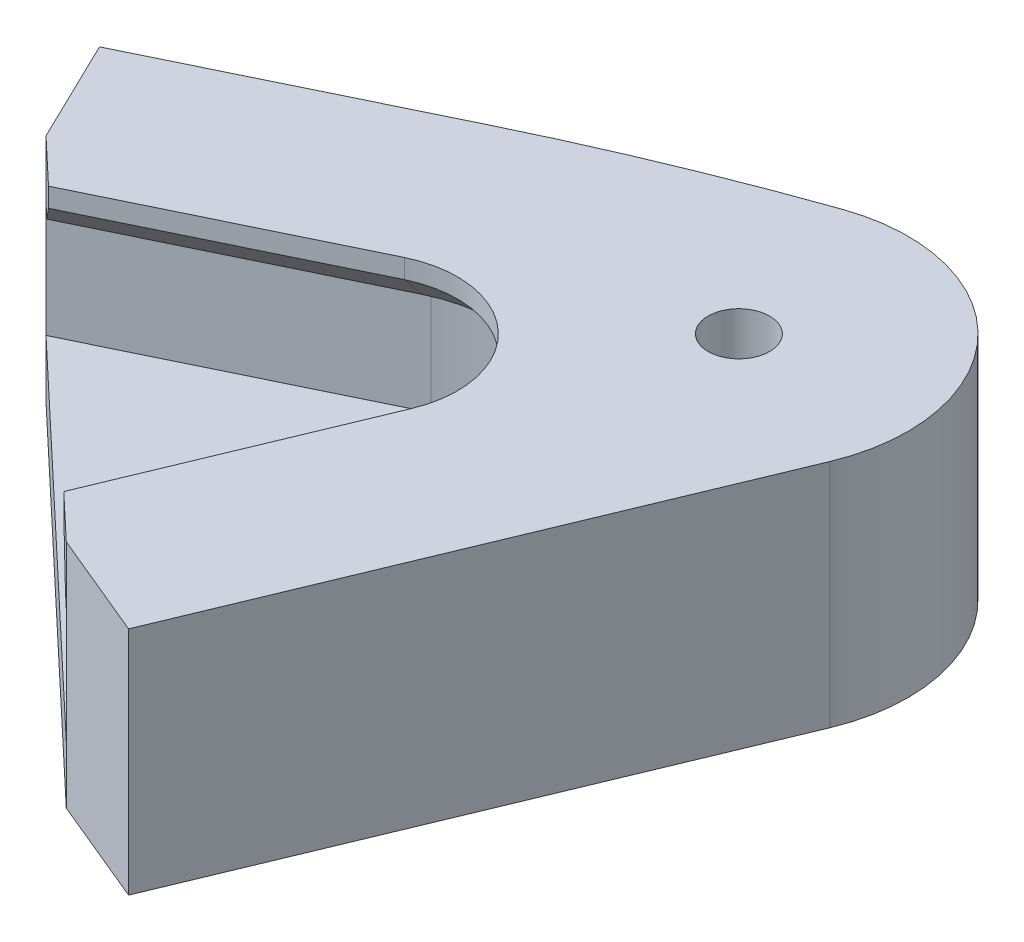
ISO-10303-21;
HEADER;
FILE_DESCRIPTION(('STEP AP214'),'2;1');
FILE_NAME('part.step','',(''),(''),'','','');
FILE_SCHEMA(('AUTOMOTIVE_DESIGN { 1 0 10303 214 1 1 1 1 }'));
ENDSEC;
DATA;
#1=APPLICATION_CONTEXT('core data for automotive mechanical design processes');
#2=APPLICATION_PROTOCOL_DEFINITION('international standard','automotive_design',2000,#1);
#3=PRODUCT_CONTEXT('',#1,'mechanical');
#4=PRODUCT('Part','Part','',(#3));
#5=PRODUCT_RELATED_PRODUCT_CATEGORY('part','',(#4));
#6=PRODUCT_DEFINITION_FORMATION('','',#4);
#7=PRODUCT_DEFINITION_CONTEXT('part definition',#1,'design');
#8=PRODUCT_DEFINITION('design','',#6,#7);
#9=PRODUCT_DEFINITION_SHAPE('','',#8);
#10=(LENGTH_UNIT() NAMED_UNIT(*) SI_UNIT(.MILLI.,.METRE.));
#11=(NAMED_UNIT(*) PLANE_ANGLE_UNIT() SI_UNIT($,.RADIAN.));
#12=(NAMED_UNIT(*) SI_UNIT($,.STERADIAN.) SOLID_ANGLE_UNIT());
#13=UNCERTAINTY_MEASURE_WITH_UNIT(LENGTH_MEASURE(1.E-05),#10,'distance_accuracy_value','');
#14=(GEOMETRIC_REPRESENTATION_CONTEXT(3) GLOBAL_UNCERTAINTY_ASSIGNED_CONTEXT((#13)) GLOBAL_UNIT_ASSIGNED_CONTEXT((#10,
#11,#12)) REPRESENTATION_CONTEXT('',''));
#15=CARTESIAN_POINT('',(0.,0.,0.));
#16=DIRECTION('',(0.,0.,1.));
#17=DIRECTION('',(1.,0.,0.));
#18=AXIS2_PLACEMENT_3D('',#15,#16,#17);
#19=CARTESIAN_POINT('',(40.9302236157556,6.,-79.9919728911341));
#20=DIRECTION('',(0.899983686293208,0.,-0.435923576336597));
#21=DIRECTION('',(-0.435923576336597,0.,-0.899983686293208));
#22=AXIS2_PLACEMENT_3D('',#19,#20,#21);
#23=PLANE('',#22);
#24=DIRECTION('',(0.,-1.,0.));
#25=VECTOR('',#24,1.);
#26=CARTESIAN_POINT('',(38.314682157736,6.,-85.3918750088934));
#27=LINE('',#26,#25);
#28=CARTESIAN_POINT('',(38.314682157736,9.,-85.3918750088934));
#29=VERTEX_POINT('',#28);
#30=CARTESIAN_POINT('',(38.314682157736,-3.,-85.3918750088934));
#31=VERTEX_POINT('',#30);
#32=EDGE_CURVE('E156',#29,#31,#27,.T.);
#33=ORIENTED_EDGE('',*,*,#32,.T.);
#34=DIRECTION('',(-0.435923576336597,0.,-0.899983686293208));
#35=VECTOR('',#34,1.);
#36=CARTESIAN_POINT('',(40.9302236157556,-3.,-79.9919728911341));
#37=LINE('',#36,#35);
#38=CARTESIAN_POINT('',(40.9302236157556,-3.,-79.9919728911341));
#39=VERTEX_POINT('',#38);
#40=EDGE_CURVE('E244',#39,#31,#37,.T.);
#41=ORIENTED_EDGE('',*,*,#40,.F.);
#42=DIRECTION('',(0.,1.,0.));
#43=VECTOR('',#42,1.);
#44=CARTESIAN_POINT('',(40.9302236157556,-3.,-79.9919728911341));
#45=LINE('',#44,#43);
#46=CARTESIAN_POINT('',(40.9302236157556,0.,-79.9919728911341));
#47=VERTEX_POINT('',#46);
#48=EDGE_CURVE('E250',#39,#47,#45,.T.);
#49=ORIENTED_EDGE('',*,*,#48,.T.);
#50=DIRECTION('',(0.,-1.,0.));
#51=VECTOR('',#50,1.);
#52=CARTESIAN_POINT('',(40.9302236157556,6.,-79.9919728911341));
#53=LINE('',#52,#51);
#54=CARTESIAN_POINT('',(40.9302236157556,6.,-79.9919728911341));
#55=VERTEX_POINT('',#54);
#56=EDGE_CURVE('E290',#55,#47,#53,.T.);
#57=ORIENTED_EDGE('',*,*,#56,.F.);
#58=DIRECTION('',(0.,-1.,0.));
#59=VECTOR('',#58,1.);
#60=CARTESIAN_POINT('',(40.9302236157556,9.,-79.9919728911341));
#61=LINE('',#60,#59);
#62=CARTESIAN_POINT('',(40.9302236157556,9.,-79.9919728911341));
#63=VERTEX_POINT('',#62);
#64=EDGE_CURVE('E173',#63,#55,#61,.T.);
#65=ORIENTED_EDGE('',*,*,#64,.F.);
#66=DIRECTION('',(0.435923576336597,0.,0.899983686293208));
#67=VECTOR('',#66,1.);
#68=CARTESIAN_POINT('',(38.314682157736,9.,-85.3918750088934));
#69=LINE('',#68,#67);
#70=EDGE_CURVE('E170',#29,#63,#69,.T.);
#71=ORIENTED_EDGE('',*,*,#70,.F.);
#72=EDGE_LOOP('',(#33,#41,#49,#57,#65,#71));
#73=FACE_BOUND('',#72,.T.);
#74=ADVANCED_FACE('F35',(#73),#23,.F.);
#75=CARTESIAN_POINT('',(40.9302236157556,6.,-79.9919728911341));
#76=DIRECTION('',(-0.435923576336596,0.,-0.899983686293208));
#77=DIRECTION('',(-0.899983686293208,0.,0.435923576336596));
#78=AXIS2_PLACEMENT_3D('',#75,#76,#77);
#79=PLANE('',#78);
#80=DIRECTION('',(0.899983686293208,0.,-0.435923576336596));
#81=VECTOR('',#80,1.);
#82=CARTESIAN_POINT('',(40.9302236157556,0.,-79.9919728911341));
#83=LINE('',#82,#81);
#84=CARTESIAN_POINT('',(54.4299789101537,0.,-86.530826536183));
#85=VERTEX_POINT('',#84);
#86=EDGE_CURVE('E257',#47,#85,#83,.T.);
#87=ORIENTED_EDGE('',*,*,#86,.T.);
#88=DIRECTION('',(0.,-1.,0.));
#89=VECTOR('',#88,1.);
#90=CARTESIAN_POINT('',(54.4299789101537,6.,-86.530826536183));
#91=LINE('',#90,#89);
#92=CARTESIAN_POINT('',(54.4299789101537,6.,-86.530826536183));
#93=VERTEX_POINT('',#92);
#94=EDGE_CURVE('E287',#93,#85,#91,.T.);
#95=ORIENTED_EDGE('',*,*,#94,.F.);
#96=DIRECTION('',(0.899983686293208,0.,-0.435923576336596));
#97=VECTOR('',#96,1.);
#98=CARTESIAN_POINT('',(40.9302236157556,6.,-79.9919728911341));
#99=LINE('',#98,#97);
#100=EDGE_CURVE('E258',#55,#93,#99,.T.);
#101=ORIENTED_EDGE('',*,*,#100,.F.);
#102=ORIENTED_EDGE('',*,*,#56,.T.);
#103=EDGE_LOOP('',(#87,#95,#101,#102));
#104=FACE_BOUND('',#103,.T.);
#105=ADVANCED_FACE('F336',(#104),#79,.F.);
#106=CARTESIAN_POINT('',(57.9827560572969,6.,-79.1959594928934));
#107=DIRECTION('',(0.,-1.,0.));
#108=DIRECTION('',(0.,0.,-1.));
#109=AXIS2_PLACEMENT_3D('',#106,#107,#108);
#110=CYLINDRICAL_SURFACE('',#109,8.14999999999999);
#111=CARTESIAN_POINT('',(57.9827560572969,0.,-79.1959594928934));
#112=DIRECTION('',(0.,-1.,0.));
#113=DIRECTION('',(0.,0.,-1.));
#114=AXIS2_PLACEMENT_3D('',#111,#112,#113);
#115=CIRCLE('',#114,8.14999999999999);
#116=CARTESIAN_POINT('',(65.5101496199308,0.,-76.0717242019432));
#117=VERTEX_POINT('',#116);
#118=EDGE_CURVE('E269',#85,#117,#115,.T.);
#119=ORIENTED_EDGE('',*,*,#118,.T.);
#120=DIRECTION('',(0.,-1.,0.));
#121=VECTOR('',#120,1.);
#122=CARTESIAN_POINT('',(65.5101496199308,6.,-76.0717242019432));
#123=LINE('',#122,#121);
#124=CARTESIAN_POINT('',(65.5101496199308,6.,-76.0717242019432));
#125=VERTEX_POINT('',#124);
#126=EDGE_CURVE('E284',#125,#117,#123,.T.);
#127=ORIENTED_EDGE('',*,*,#126,.F.);
#128=CARTESIAN_POINT('',(57.9827560572969,6.,-79.1959594928934));
#129=DIRECTION('',(0.,-1.,0.));
#130=DIRECTION('',(0.,0.,-1.));
#131=AXIS2_PLACEMENT_3D('',#128,#129,#130);
#132=CIRCLE('',#131,8.14999999999999);
#133=EDGE_CURVE('E261',#93,#125,#132,.T.);
#134=ORIENTED_EDGE('',*,*,#133,.F.);
#135=ORIENTED_EDGE('',*,*,#94,.T.);
#136=EDGE_LOOP('',(#119,#127,#134,#135));
#137=FACE_BOUND('',#136,.T.);
#138=ADVANCED_FACE('F341',(#137),#110,.F.);
#139=CARTESIAN_POINT('',(65.5101496199307,6.,-76.0717242019432));
#140=DIRECTION('',(0.923606572102308,0.,0.38334175349083));
#141=DIRECTION('',(0.38334175349083,0.,-0.923606572102308));
#142=AXIS2_PLACEMENT_3D('',#139,#140,#141);
#143=PLANE('',#142);
#144=DIRECTION('',(-0.38334175349083,0.,0.923606572102308));
#145=VECTOR('',#144,1.);
#146=CARTESIAN_POINT('',(65.5101496199307,0.,-76.0717242019432));
#147=LINE('',#146,#145);
#148=CARTESIAN_POINT('',(59.7600233175683,0.,-62.2176256204085));
#149=VERTEX_POINT('',#148);
#150=EDGE_CURVE('E262',#117,#149,#147,.T.);
#151=ORIENTED_EDGE('',*,*,#150,.T.);
#152=DIRECTION('',(0.,-1.,0.));
#153=VECTOR('',#152,1.);
#154=CARTESIAN_POINT('',(59.7600233175683,6.,-62.2176256204085));
#155=LINE('',#154,#153);
#156=CARTESIAN_POINT('',(59.7600233175683,6.,-62.2176256204085));
#157=VERTEX_POINT('',#156);
#158=EDGE_CURVE('E281',#157,#149,#155,.T.);
#159=ORIENTED_EDGE('',*,*,#158,.F.);
#160=DIRECTION('',(-0.38334175349083,0.,0.923606572102308));
#161=VECTOR('',#160,1.);
#162=CARTESIAN_POINT('',(65.5101496199307,6.,-76.0717242019432));
#163=LINE('',#162,#161);
#164=EDGE_CURVE('E167',#125,#157,#163,.T.);
#165=ORIENTED_EDGE('',*,*,#164,.F.);
#166=ORIENTED_EDGE('',*,*,#126,.T.);
#167=EDGE_LOOP('',(#151,#159,#165,#166));
#168=FACE_BOUND('',#167,.T.);
#169=ADVANCED_FACE('F414',(#168),#143,.F.);
#170=CARTESIAN_POINT('',(59.7600233175683,6.,-62.2176256204085));
#171=DIRECTION('',(0.38334175349083,0.,-0.923606572102308));
#172=DIRECTION('',(-0.923606572102308,0.,-0.38334175349083));
#173=AXIS2_PLACEMENT_3D('',#170,#171,#172);
#174=PLANE('',#173);
#175=ORIENTED_EDGE('',*,*,#158,.T.);
#176=DIRECTION('',(0.,1.,0.));
#177=VECTOR('',#176,1.);
#178=CARTESIAN_POINT('',(59.7600233175683,-3.,-62.2176256204085));
#179=LINE('',#178,#177);
#180=CARTESIAN_POINT('',(59.7600233175683,-3.,-62.2176256204085));
#181=VERTEX_POINT('',#180);
#182=EDGE_CURVE('E255',#181,#149,#179,.T.);
#183=ORIENTED_EDGE('',*,*,#182,.F.);
#184=DIRECTION('',(-0.923606572102308,0.,-0.38334175349083));
#185=VECTOR('',#184,1.);
#186=CARTESIAN_POINT('',(65.3016627501821,-3.,-59.9175750994636));
#187=LINE('',#186,#185);
#188=CARTESIAN_POINT('',(65.3016627501821,-3.,-59.9175750994636));
#189=VERTEX_POINT('',#188);
#190=EDGE_CURVE('E240',#189,#181,#187,.T.);
#191=ORIENTED_EDGE('',*,*,#190,.F.);
#192=DIRECTION('',(0.,-1.,0.));
#193=VECTOR('',#192,1.);
#194=CARTESIAN_POINT('',(65.3016627501821,6.,-59.9175750994636));
#195=LINE('',#194,#193);
#196=CARTESIAN_POINT('',(65.3016627501821,9.,-59.9175750994636));
#197=VERTEX_POINT('',#196);
#198=EDGE_CURVE('E279',#197,#189,#195,.T.);
#199=ORIENTED_EDGE('',*,*,#198,.F.);
#200=DIRECTION('',(0.923606572102308,0.,0.38334175349083));
#201=VECTOR('',#200,1.);
#202=CARTESIAN_POINT('',(59.7600233175683,9.,-62.2176256204085));
#203=LINE('',#202,#201);
#204=CARTESIAN_POINT('',(59.7600233175683,9.,-62.2176256204085));
#205=VERTEX_POINT('',#204);
#206=EDGE_CURVE('E200',#205,#197,#203,.T.);
#207=ORIENTED_EDGE('',*,*,#206,.F.);
#208=DIRECTION('',(0.,-1.,0.));
#209=VECTOR('',#208,1.);
#210=CARTESIAN_POINT('',(59.7600233175683,9.,-62.2176256204085));
#211=LINE('',#210,#209);
#212=EDGE_CURVE('E209',#205,#157,#211,.T.);
#213=ORIENTED_EDGE('',*,*,#212,.T.);
#214=EDGE_LOOP('',(#175,#183,#191,#199,#207,#213));
#215=FACE_BOUND('',#214,.T.);
#216=ADVANCED_FACE('F410',(#215),#174,.F.);
#217=CARTESIAN_POINT('',(65.3016627501821,6.,-59.9175750994636));
#218=DIRECTION('',(-0.923606572102308,0.,-0.383341753490829));
#219=DIRECTION('',(-0.383341753490829,0.,0.923606572102308));
#220=AXIS2_PLACEMENT_3D('',#217,#218,#219);
#221=PLANE('',#220);
#222=ORIENTED_EDGE('',*,*,#198,.T.);
#223=DIRECTION('',(-0.383341753490829,0.,0.923606572102308));
#224=VECTOR('',#223,1.);
#225=CARTESIAN_POINT('',(76.011513854078,-3.,-85.7214140387876));
#226=LINE('',#225,#224);
#227=CARTESIAN_POINT('',(76.011513854078,-3.,-85.7214140387876));
#228=VERTEX_POINT('',#227);
#229=EDGE_CURVE('E237',#228,#189,#226,.T.);
#230=ORIENTED_EDGE('',*,*,#229,.F.);
#231=DIRECTION('',(0.,-1.,0.));
#232=VECTOR('',#231,1.);
#233=CARTESIAN_POINT('',(76.011513854078,6.,-85.7214140387876));
#234=LINE('',#233,#232);
#235=CARTESIAN_POINT('',(76.011513854078,9.,-85.7214140387876));
#236=VERTEX_POINT('',#235);
#237=EDGE_CURVE('E277',#236,#228,#234,.T.);
#238=ORIENTED_EDGE('',*,*,#237,.F.);
#239=DIRECTION('',(0.383341753490829,0.,-0.923606572102308));
#240=VECTOR('',#239,1.);
#241=CARTESIAN_POINT('',(65.3016627501821,9.,-59.9175750994636));
#242=LINE('',#241,#240);
#243=EDGE_CURVE('E203',#197,#236,#242,.T.);
#244=ORIENTED_EDGE('',*,*,#243,.F.);
#245=EDGE_LOOP('',(#222,#230,#238,#244));
#246=FACE_BOUND('',#245,.T.);
#247=ADVANCED_FACE('F406',(#246),#221,.F.);
#248=CARTESIAN_POINT('',(67.8822509939085,6.,-89.095454429505));
#249=DIRECTION('',(0.,-1.,0.));
#250=DIRECTION('',(0.,0.,-1.));
#251=AXIS2_PLACEMENT_3D('',#248,#249,#250);
#252=CYLINDRICAL_SURFACE('',#251,8.80165116372627);
#253=ORIENTED_EDGE('',*,*,#237,.T.);
#254=CARTESIAN_POINT('',(67.8822509939085,-3.,-89.095454429505));
#255=DIRECTION('',(0.,-1.,0.));
#256=DIRECTION('',(0.,0.,-1.));
#257=AXIS2_PLACEMENT_3D('',#254,#255,#256);
#258=CIRCLE('',#257,8.80165116372627);
#259=CARTESIAN_POINT('',(64.9710822598467,-3.,-97.4017267468411));
#260=VERTEX_POINT('',#259);
#261=EDGE_CURVE('E234',#260,#228,#258,.T.);
#262=ORIENTED_EDGE('',*,*,#261,.F.);
#263=DIRECTION('',(0.,-1.,0.));
#264=VECTOR('',#263,1.);
#265=CARTESIAN_POINT('',(64.9710822598468,6.,-97.4017267468412));
#266=LINE('',#265,#264);
#267=CARTESIAN_POINT('',(64.9710822598467,9.,-97.4017267468411));
#268=VERTEX_POINT('',#267);
#269=EDGE_CURVE('E275',#268,#260,#266,.T.);
#270=ORIENTED_EDGE('',*,*,#269,.F.);
#271=CARTESIAN_POINT('',(67.8822509939085,9.,-89.095454429505));
#272=DIRECTION('',(0.,1.,0.));
#273=DIRECTION('',(0.,0.,1.));
#274=AXIS2_PLACEMENT_3D('',#271,#272,#273);
#275=CIRCLE('',#274,8.80165116372627);
#276=EDGE_CURVE('E206',#236,#268,#275,.T.);
#277=ORIENTED_EDGE('',*,*,#276,.F.);
#278=EDGE_LOOP('',(#253,#262,#270,#277));
#279=FACE_BOUND('',#278,.T.);
#280=ADVANCED_FACE('F402',(#279),#252,.T.);
#281=CARTESIAN_POINT('',(106.347448057997,6.,20.6551065105116));
#282=DIRECTION('',(0.,-1.,0.));
#283=DIRECTION('',(0.,0.,-1.));
#284=AXIS2_PLACEMENT_3D('',#281,#282,#283);
#285=CYLINDRICAL_SURFACE('',#284,125.097639967414);
#286=ORIENTED_EDGE('',*,*,#269,.T.);
#287=CARTESIAN_POINT('',(106.347448057999,-3.,20.6551065105158));
#288=DIRECTION('',(0.,-1.,0.));
#289=DIRECTION('',(0.,0.,-1.));
#290=AXIS2_PLACEMENT_3D('',#287,#288,#289);
#291=CIRCLE('',#290,125.097639967419);
#292=CARTESIAN_POINT('',(51.8144374521341,-3.,-91.9307286539423));
#293=VERTEX_POINT('',#292);
#294=EDGE_CURVE('E247',#293,#260,#291,.T.);
#295=ORIENTED_EDGE('',*,*,#294,.F.);
#296=DIRECTION('',(0.,-1.,0.));
#297=VECTOR('',#296,1.);
#298=CARTESIAN_POINT('',(51.8144374521341,6.,-91.9307286539423));
#299=LINE('',#298,#297);
#300=CARTESIAN_POINT('',(51.8144374521342,9.,-91.9307286539422));
#301=VERTEX_POINT('',#300);
#302=EDGE_CURVE('E166',#301,#293,#299,.T.);
#303=ORIENTED_EDGE('',*,*,#302,.F.);
#304=CARTESIAN_POINT('',(106.347448058038,9.,20.6551065106094));
#305=DIRECTION('',(0.,1.,0.));
#306=DIRECTION('',(0.,0.,1.));
#307=AXIS2_PLACEMENT_3D('',#304,#305,#306);
#308=CIRCLE('',#307,125.09763996752);
#309=EDGE_CURVE('E183',#268,#301,#308,.T.);
#310=ORIENTED_EDGE('',*,*,#309,.F.);
#311=EDGE_LOOP('',(#286,#295,#303,#310));
#312=FACE_BOUND('',#311,.T.);
#313=ADVANCED_FACE('F399',(#312),#285,.T.);
#314=CARTESIAN_POINT('',(38.314682157736,6.,-85.3918750088934));
#315=DIRECTION('',(0.435923576336597,0.,0.899983686293208));
#316=DIRECTION('',(0.899983686293208,0.,-0.435923576336597));
#317=AXIS2_PLACEMENT_3D('',#314,#315,#316);
#318=PLANE('',#317);
#319=ORIENTED_EDGE('',*,*,#302,.T.);
#320=DIRECTION('',(0.899983686293209,0.,-0.435923576336594));
#321=VECTOR('',#320,1.);
#322=CARTESIAN_POINT('',(38.314682157736,-3.,-85.3918750088934));
#323=LINE('',#322,#321);
#324=EDGE_CURVE('E162',#31,#293,#323,.T.);
#325=ORIENTED_EDGE('',*,*,#324,.F.);
#326=ORIENTED_EDGE('',*,*,#32,.F.);
#327=DIRECTION('',(-0.899983686293209,0.,0.435923576336594));
#328=VECTOR('',#327,1.);
#329=CARTESIAN_POINT('',(51.8144374521341,9.,-91.9307286539423));
#330=LINE('',#329,#328);
#331=EDGE_CURVE('E160',#301,#29,#330,.T.);
#332=ORIENTED_EDGE('',*,*,#331,.F.);
#333=EDGE_LOOP('',(#319,#325,#326,#332));
#334=FACE_BOUND('',#333,.T.);
#335=ADVANCED_FACE('F158',(#334),#318,.F.);
#336=CARTESIAN_POINT('',(67.8822509939085,6.,-89.095454429505));
#337=DIRECTION('',(0.,-1.,0.));
#338=DIRECTION('',(0.,0.,-1.));
#339=AXIS2_PLACEMENT_3D('',#336,#337,#338);
#340=CYLINDRICAL_SURFACE('',#339,1.60000000000001);
#341=CARTESIAN_POINT('',(67.8822509939085,-3.,-89.095454429505));
#342=DIRECTION('',(0.,-1.,0.));
#343=DIRECTION('',(0.,0.,-1.));
#344=AXIS2_PLACEMENT_3D('',#341,#342,#343);
#345=CIRCLE('',#344,1.60000000000001);
#346=CARTESIAN_POINT('',(67.8822509939085,-3.,-90.695454429505));
#347=VERTEX_POINT('',#346);
#348=EDGE_CURVE('E228',#347,#347,#345,.T.);
#349=ORIENTED_EDGE('',*,*,#348,.T.);
#350=EDGE_LOOP('',(#349));
#351=FACE_BOUND('',#350,.T.);
#352=CARTESIAN_POINT('',(67.8822509939085,9.,-89.095454429505));
#353=DIRECTION('',(0.,1.,0.));
#354=DIRECTION('',(0.,0.,1.));
#355=AXIS2_PLACEMENT_3D('',#352,#353,#354);
#356=CIRCLE('',#355,1.60000000000001);
#357=CARTESIAN_POINT('',(67.8822509939085,9.,-87.495454429505));
#358=VERTEX_POINT('',#357);
#359=EDGE_CURVE('E189',#358,#358,#356,.T.);
#360=ORIENTED_EDGE('',*,*,#359,.T.);
#361=EDGE_LOOP('',(#360));
#362=FACE_BOUND('',#361,.T.);
#363=ADVANCED_FACE('F320',(#351,#362),#340,.F.);
#364=CARTESIAN_POINT('',(67.8822509939085,-3.,-89.095454429505));
#365=DIRECTION('',(0.,-1.,0.));
#366=DIRECTION('',(0.,0.,-1.));
#367=AXIS2_PLACEMENT_3D('',#364,#365,#366);
#368=PLANE('',#367);
#369=ORIENTED_EDGE('',*,*,#348,.F.);
#370=EDGE_LOOP('',(#369));
#371=FACE_BOUND('',#370,.T.);
#372=ORIENTED_EDGE('',*,*,#261,.T.);
#373=ORIENTED_EDGE('',*,*,#229,.T.);
#374=ORIENTED_EDGE('',*,*,#190,.T.);
#375=DIRECTION('',(-0.72719342530789,0.,-0.686432605715214));
#376=VECTOR('',#375,1.);
#377=CARTESIAN_POINT('',(59.7600233175683,-3.,-62.2176256204085));
#378=LINE('',#377,#376);
#379=EDGE_CURVE('E242',#181,#39,#378,.T.);
#380=ORIENTED_EDGE('',*,*,#379,.T.);
#381=ORIENTED_EDGE('',*,*,#40,.T.);
#382=ORIENTED_EDGE('',*,*,#324,.T.);
#383=ORIENTED_EDGE('',*,*,#294,.T.);
#384=EDGE_LOOP('',(#372,#373,#374,#380,#381,#382,#383));
#385=FACE_BOUND('',#384,.T.);
#386=CARTESIAN_POINT('',(57.9827560572969,-3.,-79.1959594928934));
#387=DIRECTION('',(0.,-1.,0.));
#388=DIRECTION('',(0.,0.,-1.));
#389=AXIS2_PLACEMENT_3D('',#386,#387,#388);
#390=CIRCLE('',#389,1.60000000000001);
#391=CARTESIAN_POINT('',(57.9827560572969,-3.,-80.7959594928934));
#392=VERTEX_POINT('',#391);
#393=EDGE_CURVE('E225',#392,#392,#390,.T.);
#394=ORIENTED_EDGE('',*,*,#393,.F.);
#395=EDGE_LOOP('',(#394));
#396=FACE_BOUND('',#395,.T.);
#397=ADVANCED_FACE('F383',(#371,#385,#396),#368,.T.);
#398=CARTESIAN_POINT('',(67.8822509939085,0.,-89.095454429505));
#399=DIRECTION('',(0.,-1.,0.));
#400=DIRECTION('',(0.,0.,-1.));
#401=AXIS2_PLACEMENT_3D('',#398,#399,#400);
#402=PLANE('',#401);
#403=ORIENTED_EDGE('',*,*,#150,.F.);
#404=ORIENTED_EDGE('',*,*,#118,.F.);
#405=ORIENTED_EDGE('',*,*,#86,.F.);
#406=DIRECTION('',(-0.72719342530789,0.,-0.686432605715214));
#407=VECTOR('',#406,1.);
#408=CARTESIAN_POINT('',(59.7600233175683,0.,-62.2176256204085));
#409=LINE('',#408,#407);
#410=EDGE_CURVE('E233',#149,#47,#409,.T.);
#411=ORIENTED_EDGE('',*,*,#410,.F.);
#412=EDGE_LOOP('',(#403,#404,#405,#411));
#413=FACE_BOUND('',#412,.T.);
#414=CARTESIAN_POINT('',(57.9827560572969,0.,-79.1959594928934));
#415=DIRECTION('',(0.,-1.,0.));
#416=DIRECTION('',(0.,0.,-1.));
#417=AXIS2_PLACEMENT_3D('',#414,#415,#416);
#418=CIRCLE('',#417,1.60000000000001);
#419=CARTESIAN_POINT('',(57.9827560572969,0.,-80.7959594928934));
#420=VERTEX_POINT('',#419);
#421=EDGE_CURVE('E224',#420,#420,#418,.T.);
#422=ORIENTED_EDGE('',*,*,#421,.T.);
#423=EDGE_LOOP('',(#422));
#424=FACE_BOUND('',#423,.T.);
#425=ADVANCED_FACE('F386',(#413,#424),#402,.F.);
#426=CARTESIAN_POINT('',(59.7600233175683,-3.,-62.2176256204085));
#427=DIRECTION('',(0.686432605715214,0.,-0.72719342530789));
#428=DIRECTION('',(-0.72719342530789,0.,-0.686432605715214));
#429=AXIS2_PLACEMENT_3D('',#426,#427,#428);
#430=PLANE('',#429);
#431=ORIENTED_EDGE('',*,*,#410,.T.);
#432=ORIENTED_EDGE('',*,*,#48,.F.);
#433=ORIENTED_EDGE('',*,*,#379,.F.);
#434=ORIENTED_EDGE('',*,*,#182,.T.);
#435=EDGE_LOOP('',(#431,#432,#433,#434));
#436=FACE_BOUND('',#435,.T.);
#437=ADVANCED_FACE('F332',(#436),#430,.F.);
#438=CARTESIAN_POINT('',(57.9827560572969,-3.,-79.1959594928934));
#439=DIRECTION('',(0.,1.,0.));
#440=DIRECTION('',(0.,0.,1.));
#441=AXIS2_PLACEMENT_3D('',#438,#439,#440);
#442=CYLINDRICAL_SURFACE('',#441,1.60000000000001);
#443=ORIENTED_EDGE('',*,*,#393,.T.);
#444=EDGE_LOOP('',(#443));
#445=FACE_BOUND('',#444,.T.);
#446=ORIENTED_EDGE('',*,*,#421,.F.);
#447=EDGE_LOOP('',(#446));
#448=FACE_BOUND('',#447,.T.);
#449=ADVANCED_FACE('F323',(#445,#448),#442,.F.);
#450=CARTESIAN_POINT('',(57.9827560572969,9.,-79.1959594928934));
#451=DIRECTION('',(0.,-1.,0.));
#452=DIRECTION('',(0.,0.,-1.));
#453=AXIS2_PLACEMENT_3D('',#450,#451,#452);
#454=PLANE('',#453);
#455=ORIENTED_EDGE('',*,*,#331,.T.);
#456=ORIENTED_EDGE('',*,*,#70,.T.);
#457=DIRECTION('',(0.727193425307889,0.,0.686432605715215));
#458=VECTOR('',#457,1.);
#459=CARTESIAN_POINT('',(40.9302236157556,9.,-79.9919728911341));
#460=LINE('',#459,#458);
#461=CARTESIAN_POINT('',(43.2640164121194,9.,-77.7889944061057));
#462=VERTEX_POINT('',#461);
#463=EDGE_CURVE('E176',#63,#462,#460,.T.);
#464=ORIENTED_EDGE('',*,*,#463,.T.);
#465=DIRECTION('',(0.899983686293208,0.,-0.435923576336597));
#466=VECTOR('',#465,1.);
#467=CARTESIAN_POINT('',(43.2640164121194,9.,-77.7889944061057));
#468=LINE('',#467,#466);
#469=CARTESIAN_POINT('',(55.7377496391635,9.,-83.8308754773034));
#470=VERTEX_POINT('',#469);
#471=EDGE_CURVE('E192',#462,#470,#468,.T.);
#472=ORIENTED_EDGE('',*,*,#471,.T.);
#473=CARTESIAN_POINT('',(57.9827560572969,9.,-79.1959594928934));
#474=DIRECTION('',(0.,-1.,0.));
#475=DIRECTION('',(0.,0.,-1.));
#476=AXIS2_PLACEMENT_3D('',#473,#474,#475);
#477=CIRCLE('',#476,5.15000000000002);
#478=CARTESIAN_POINT('',(62.7393299036238,9.,-77.2217494624156));
#479=VERTEX_POINT('',#478);
#480=EDGE_CURVE('E194',#470,#479,#477,.T.);
#481=ORIENTED_EDGE('',*,*,#480,.T.);
#482=DIRECTION('',(-0.383341753490832,0.,0.923606572102307));
#483=VECTOR('',#482,1.);
#484=CARTESIAN_POINT('',(62.7393299036238,9.,-77.2217494624156));
#485=LINE('',#484,#483);
#486=CARTESIAN_POINT('',(57.4262305212045,9.,-64.420604105437));
#487=VERTEX_POINT('',#486);
#488=EDGE_CURVE('E196',#479,#487,#485,.T.);
#489=ORIENTED_EDGE('',*,*,#488,.T.);
#490=DIRECTION('',(0.727193425307889,0.,0.686432605715214));
#491=VECTOR('',#490,1.);
#492=CARTESIAN_POINT('',(57.4262305212045,9.,-64.420604105437));
#493=LINE('',#492,#491);
#494=EDGE_CURVE('E198',#487,#205,#493,.T.);
#495=ORIENTED_EDGE('',*,*,#494,.T.);
#496=ORIENTED_EDGE('',*,*,#206,.T.);
#497=ORIENTED_EDGE('',*,*,#243,.T.);
#498=ORIENTED_EDGE('',*,*,#276,.T.);
#499=ORIENTED_EDGE('',*,*,#309,.T.);
#500=EDGE_LOOP('',(#455,#456,#464,#472,#481,#489,#495,#496,#497,#498,#499));
#501=FACE_BOUND('',#500,.T.);
#502=ORIENTED_EDGE('',*,*,#359,.F.);
#503=EDGE_LOOP('',(#502));
#504=FACE_BOUND('',#503,.T.);
#505=ADVANCED_FACE('F179',(#501,#504),#454,.F.);
#506=CARTESIAN_POINT('',(57.9827560572969,6.,-79.1959594928934));
#507=DIRECTION('',(0.,-1.,0.));
#508=DIRECTION('',(0.,0.,-1.));
#509=AXIS2_PLACEMENT_3D('',#506,#507,#508);
#510=PLANE('',#509);
#511=DIRECTION('',(0.727193425307889,0.,0.686432605715214));
#512=VECTOR('',#511,1.);
#513=CARTESIAN_POINT('',(57.4262305212045,6.,-64.420604105437));
#514=LINE('',#513,#512);
#515=CARTESIAN_POINT('',(58.9820923854471,6.,-62.9519517820847));
#516=VERTEX_POINT('',#515);
#517=EDGE_CURVE('E184',#516,#157,#514,.T.);
#518=ORIENTED_EDGE('',*,*,#517,.F.);
#519=DIRECTION('',(0.383341753490832,0.,-0.923606572102307));
#520=VECTOR('',#519,1.);
#521=CARTESIAN_POINT('',(64.5865430478285,6.,-76.4550659554339));
#522=LINE('',#521,#520);
#523=CARTESIAN_POINT('',(64.5865430478285,6.,-76.4550659554339));
#524=VERTEX_POINT('',#523);
#525=EDGE_CURVE('E302',#516,#524,#522,.T.);
#526=ORIENTED_EDGE('',*,*,#525,.T.);
#527=CARTESIAN_POINT('',(57.9827560572969,6.,-79.1959594928934));
#528=DIRECTION('',(0.,-1.,0.));
#529=DIRECTION('',(0.,0.,-1.));
#530=AXIS2_PLACEMENT_3D('',#527,#528,#529);
#531=CIRCLE('',#530,7.15000000000005);
#532=CARTESIAN_POINT('',(54.8659024864902,6.,-85.6308428498898));
#533=VERTEX_POINT('',#532);
#534=EDGE_CURVE('E300',#524,#533,#531,.F.);
#535=ORIENTED_EDGE('',*,*,#534,.T.);
#536=DIRECTION('',(-0.899983686293208,0.,0.435923576336597));
#537=VECTOR('',#536,1.);
#538=CARTESIAN_POINT('',(42.3921692594462,6.,-79.5889617786921));
#539=LINE('',#538,#537);
#540=CARTESIAN_POINT('',(41.7081545478768,6.,-79.257646729458));
#541=VERTEX_POINT('',#540);
#542=EDGE_CURVE('E298',#533,#541,#539,.T.);
#543=ORIENTED_EDGE('',*,*,#542,.T.);
#544=DIRECTION('',(0.727193425307889,0.,0.686432605715215));
#545=VECTOR('',#544,1.);
#546=CARTESIAN_POINT('',(40.9302236157556,6.,-79.9919728911341));
#547=LINE('',#546,#545);
#548=EDGE_CURVE('E186',#55,#541,#547,.T.);
#549=ORIENTED_EDGE('',*,*,#548,.F.);
#550=ORIENTED_EDGE('',*,*,#100,.T.);
#551=ORIENTED_EDGE('',*,*,#133,.T.);
#552=ORIENTED_EDGE('',*,*,#164,.T.);
#553=EDGE_LOOP('',(#518,#526,#535,#543,#549,#550,#551,#552));
#554=FACE_BOUND('',#553,.T.);
#555=ADVANCED_FACE('F322',(#554),#510,.T.);
#556=CARTESIAN_POINT('',(40.9302236157556,9.,-79.9919728911341));
#557=DIRECTION('',(0.686432605715215,0.,-0.727193425307889));
#558=DIRECTION('',(-0.727193425307889,0.,-0.686432605715215));
#559=AXIS2_PLACEMENT_3D('',#556,#557,#558);
#560=PLANE('',#559);
#561=ORIENTED_EDGE('',*,*,#548,.T.);
#562=DIRECTION('',(0.531235368679378,0.682882434345166,0.501458436888747));
#563=VECTOR('',#562,1.);
#564=CARTESIAN_POINT('',(43.2640164121194,8.00000000000003,-77.7889944061057));
#565=LINE('',#564,#563);
#566=CARTESIAN_POINT('',(43.2640164121194,8.00000000000003,-77.7889944061057));
#567=VERTEX_POINT('',#566);
#568=EDGE_CURVE('E11',#541,#567,#565,.T.);
#569=ORIENTED_EDGE('',*,*,#568,.T.);
#570=DIRECTION('',(0.,-1.,0.));
#571=VECTOR('',#570,1.);
#572=CARTESIAN_POINT('',(43.2640164121194,9.,-77.7889944061057));
#573=LINE('',#572,#571);
#574=EDGE_CURVE('E221',#462,#567,#573,.T.);
#575=ORIENTED_EDGE('',*,*,#574,.F.);
#576=ORIENTED_EDGE('',*,*,#463,.F.);
#577=ORIENTED_EDGE('',*,*,#64,.T.);
#578=EDGE_LOOP('',(#561,#569,#575,#576,#577));
#579=FACE_BOUND('',#578,.T.);
#580=ADVANCED_FACE('F329',(#579),#560,.F.);
#581=CARTESIAN_POINT('',(43.2640164121194,9.,-77.7889944061057));
#582=DIRECTION('',(-0.435923576336597,0.,-0.899983686293208));
#583=DIRECTION('',(-0.899983686293208,0.,0.435923576336597));
#584=AXIS2_PLACEMENT_3D('',#581,#582,#583);
#585=PLANE('',#584);
#586=ORIENTED_EDGE('',*,*,#574,.T.);
#587=DIRECTION('',(0.899983686293208,0.,-0.435923576336597));
#588=VECTOR('',#587,1.);
#589=CARTESIAN_POINT('',(55.7377496391635,8.00000000000003,-83.8308754773034));
#590=LINE('',#589,#588);
#591=CARTESIAN_POINT('',(55.7377496391635,8.00000000000003,-83.8308754773034));
#592=VERTEX_POINT('',#591);
#593=EDGE_CURVE('E44',#567,#592,#590,.T.);
#594=ORIENTED_EDGE('',*,*,#593,.T.);
#595=DIRECTION('',(0.,-1.,0.));
#596=VECTOR('',#595,1.);
#597=CARTESIAN_POINT('',(55.7377496391635,9.,-83.8308754773034));
#598=LINE('',#597,#596);
#599=EDGE_CURVE('E219',#470,#592,#598,.T.);
#600=ORIENTED_EDGE('',*,*,#599,.F.);
#601=ORIENTED_EDGE('',*,*,#471,.F.);
#602=EDGE_LOOP('',(#586,#594,#600,#601));
#603=FACE_BOUND('',#602,.T.);
#604=ADVANCED_FACE('F372',(#603),#585,.F.);
#605=CARTESIAN_POINT('',(57.9827560572969,9.,-79.1959594928934));
#606=DIRECTION('',(0.,-1.,0.));
#607=DIRECTION('',(0.,0.,-1.));
#608=AXIS2_PLACEMENT_3D('',#605,#606,#607);
#609=CYLINDRICAL_SURFACE('',#608,5.15000000000002);
#610=ORIENTED_EDGE('',*,*,#599,.T.);
#611=CARTESIAN_POINT('',(57.9827560572969,8.00000000000003,-79.1959594928934));
#612=DIRECTION('',(0.,-1.,0.));
#613=DIRECTION('',(0.,0.,-1.));
#614=AXIS2_PLACEMENT_3D('',#611,#612,#613);
#615=CIRCLE('',#614,5.15000000000002);
#616=CARTESIAN_POINT('',(62.7393299036238,8.00000000000003,-77.2217494624156));
#617=VERTEX_POINT('',#616);
#618=EDGE_CURVE('E304',#592,#617,#615,.T.);
#619=ORIENTED_EDGE('',*,*,#618,.T.);
#620=DIRECTION('',(0.,-1.,0.));
#621=VECTOR('',#620,1.);
#622=CARTESIAN_POINT('',(62.7393299036238,9.,-77.2217494624156));
#623=LINE('',#622,#621);
#624=EDGE_CURVE('E216',#479,#617,#623,.T.);
#625=ORIENTED_EDGE('',*,*,#624,.F.);
#626=ORIENTED_EDGE('',*,*,#480,.F.);
#627=EDGE_LOOP('',(#610,#619,#625,#626));
#628=FACE_BOUND('',#627,.T.);
#629=ADVANCED_FACE('F364',(#628),#609,.F.);
#630=CARTESIAN_POINT('',(62.7393299036238,9.,-77.2217494624156));
#631=DIRECTION('',(0.923606572102307,0.,0.383341753490832));
#632=DIRECTION('',(0.383341753490832,0.,-0.923606572102307));
#633=AXIS2_PLACEMENT_3D('',#630,#631,#632);
#634=PLANE('',#633);
#635=ORIENTED_EDGE('',*,*,#624,.T.);
#636=DIRECTION('',(-0.383341753490832,0.,0.923606572102307));
#637=VECTOR('',#636,1.);
#638=CARTESIAN_POINT('',(57.4262305212045,8.00000000000003,-64.420604105437));
#639=LINE('',#638,#637);
#640=CARTESIAN_POINT('',(57.4262305212045,8.00000000000003,-64.420604105437));
#641=VERTEX_POINT('',#640);
#642=EDGE_CURVE('E293',#617,#641,#639,.T.);
#643=ORIENTED_EDGE('',*,*,#642,.T.);
#644=DIRECTION('',(0.,-1.,0.));
#645=VECTOR('',#644,1.);
#646=CARTESIAN_POINT('',(57.4262305212045,9.,-64.420604105437));
#647=LINE('',#646,#645);
#648=EDGE_CURVE('E213',#487,#641,#647,.T.);
#649=ORIENTED_EDGE('',*,*,#648,.F.);
#650=ORIENTED_EDGE('',*,*,#488,.F.);
#651=EDGE_LOOP('',(#635,#643,#649,#650));
#652=FACE_BOUND('',#651,.T.);
#653=ADVANCED_FACE('F358',(#652),#634,.F.);
#654=CARTESIAN_POINT('',(57.4262305212045,9.,-64.420604105437));
#655=DIRECTION('',(0.686432605715215,0.,-0.727193425307889));
#656=DIRECTION('',(-0.727193425307889,0.,-0.686432605715215));
#657=AXIS2_PLACEMENT_3D('',#654,#655,#656);
#658=PLANE('',#657);
#659=ORIENTED_EDGE('',*,*,#648,.T.);
#660=DIRECTION('',(0.531235368679377,-0.682882434345167,0.501458436888746));
#661=VECTOR('',#660,1.);
#662=CARTESIAN_POINT('',(55.5155171292842,10.4561478571243,-66.2242177338681));
#663=LINE('',#662,#661);
#664=EDGE_CURVE('E296',#641,#516,#663,.T.);
#665=ORIENTED_EDGE('',*,*,#664,.T.);
#666=ORIENTED_EDGE('',*,*,#517,.T.);
#667=ORIENTED_EDGE('',*,*,#212,.F.);
#668=ORIENTED_EDGE('',*,*,#494,.F.);
#669=EDGE_LOOP('',(#659,#665,#666,#667,#668));
#670=FACE_BOUND('',#669,.T.);
#671=ADVANCED_FACE('F353',(#670),#658,.F.);
#672=CARTESIAN_POINT('',(43.2640164121194,8.00000000000003,-77.7889944061057));
#673=DIRECTION('',(0.308244516906699,-0.707106781186549,0.636384567535192));
#674=DIRECTION('',(-0.899983686293208,0.,0.435923576336597));
#675=AXIS2_PLACEMENT_3D('',#672,#673,#674);
#676=PLANE('',#675);
#677=ORIENTED_EDGE('',*,*,#568,.F.);
#678=ORIENTED_EDGE('',*,*,#542,.F.);
#679=DIRECTION('',(-0.3082445169067,-0.707106781186546,-0.636384567535195));
#680=VECTOR('',#679,1.);
#681=CARTESIAN_POINT('',(55.7377496391635,8.00000000000003,-83.8308754773034));
#682=LINE('',#681,#680);
#683=EDGE_CURVE('E39',#592,#533,#682,.T.);
#684=ORIENTED_EDGE('',*,*,#683,.F.);
#685=ORIENTED_EDGE('',*,*,#593,.F.);
#686=EDGE_LOOP('',(#677,#678,#684,#685));
#687=FACE_BOUND('',#686,.T.);
#688=ADVANCED_FACE('F37',(#687),#676,.T.);
#689=CARTESIAN_POINT('',(57.9827560572969,8.00000000000003,-79.1959594928934));
#690=DIRECTION('',(0.,-1.,0.));
#691=DIRECTION('',(0.,0.,-1.));
#692=AXIS2_PLACEMENT_3D('',#689,#690,#691);
#693=CONICAL_SURFACE('',#692,5.15000000000002,0.785398163397449);
#694=ORIENTED_EDGE('',*,*,#683,.T.);
#695=ORIENTED_EDGE('',*,*,#534,.F.);
#696=DIRECTION('',(0.653088470282004,-0.707106781186546,0.271063553405311));
#697=VECTOR('',#696,1.);
#698=CARTESIAN_POINT('',(62.7393299036238,8.00000000000003,-77.2217494624156));
#699=LINE('',#698,#697);
#700=EDGE_CURVE('E306',#617,#524,#699,.T.);
#701=ORIENTED_EDGE('',*,*,#700,.F.);
#702=ORIENTED_EDGE('',*,*,#618,.F.);
#703=EDGE_LOOP('',(#694,#695,#701,#702));
#704=FACE_BOUND('',#703,.T.);
#705=ADVANCED_FACE('F348',(#704),#693,.F.);
#706=CARTESIAN_POINT('',(62.7393299036238,8.00000000000003,-77.2217494624156));
#707=DIRECTION('',(-0.653088470282003,-0.707106781186548,-0.271063553405309));
#708=DIRECTION('',(0.383341753490832,0.,-0.923606572102307));
#709=AXIS2_PLACEMENT_3D('',#706,#707,#708);
#710=PLANE('',#709);
#711=ORIENTED_EDGE('',*,*,#700,.T.);
#712=ORIENTED_EDGE('',*,*,#525,.F.);
#713=ORIENTED_EDGE('',*,*,#664,.F.);
#714=ORIENTED_EDGE('',*,*,#642,.F.);
#715=EDGE_LOOP('',(#711,#712,#713,#714));
#716=FACE_BOUND('',#715,.T.);
#717=ADVANCED_FACE('F346',(#716),#710,.T.);
#718=CLOSED_SHELL('',(#74,#105,#138,#169,#216,#247,#280,#313,#335,#363,#397,#425,#437,#449,#505,
#555,#580,#604,#629,#653,#671,#688,#705,#717));
#719=MANIFOLD_SOLID_BREP('B2',#718);
#720=ADVANCED_BREP_SHAPE_REPRESENTATION('',(#18,#719),#14);
#721=SHAPE_DEFINITION_REPRESENTATION(#9,#720);
ENDSEC;
END-ISO-10303-21;
